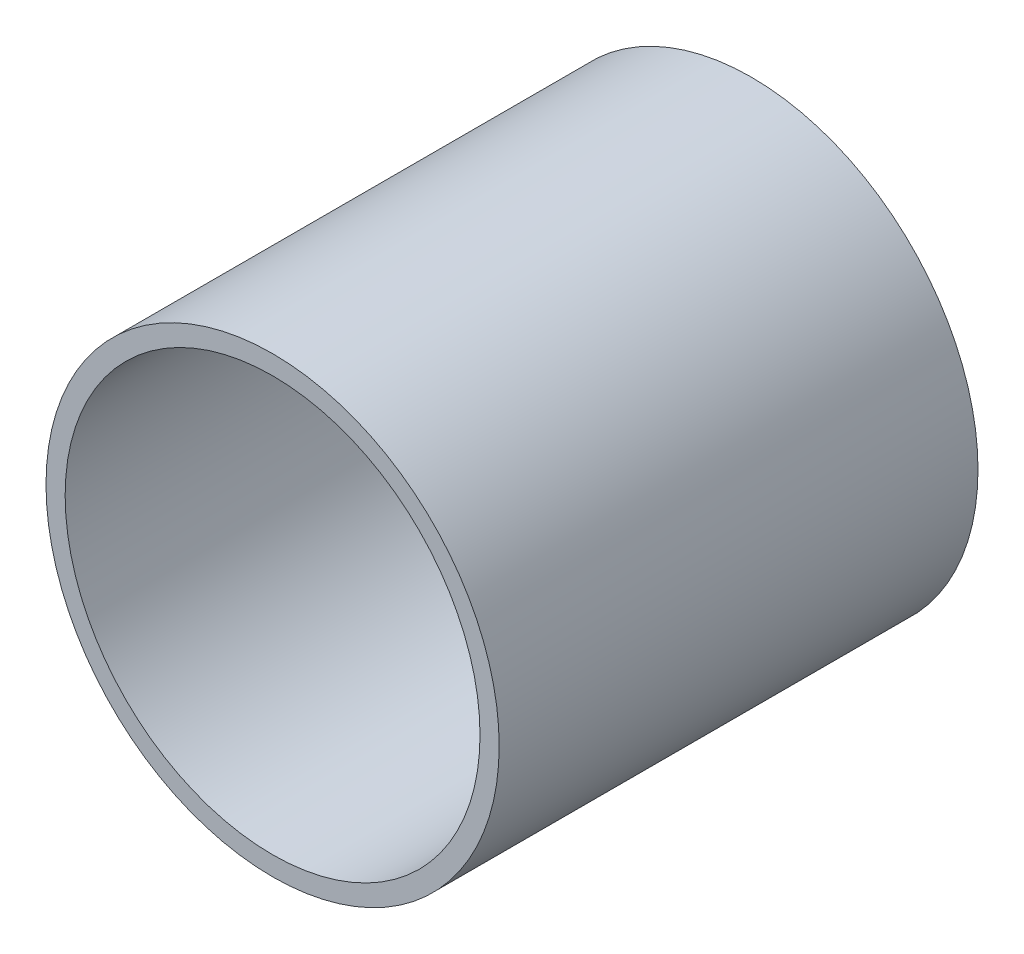
ISO-10303-21;
HEADER;
FILE_DESCRIPTION(('STEP AP214'),'2;1');
FILE_NAME('part.step','',(''),(''),'','','');
FILE_SCHEMA(('AUTOMOTIVE_DESIGN { 1 0 10303 214 1 1 1 1 }'));
ENDSEC;
DATA;
#1=APPLICATION_CONTEXT('core data for automotive mechanical design processes');
#2=APPLICATION_PROTOCOL_DEFINITION('international standard','automotive_design',2000,#1);
#3=PRODUCT_CONTEXT('',#1,'mechanical');
#4=PRODUCT('Part','Part','',(#3));
#5=PRODUCT_RELATED_PRODUCT_CATEGORY('part','',(#4));
#6=PRODUCT_DEFINITION_FORMATION('','',#4);
#7=PRODUCT_DEFINITION_CONTEXT('part definition',#1,'design');
#8=PRODUCT_DEFINITION('design','',#6,#7);
#9=PRODUCT_DEFINITION_SHAPE('','',#8);
#10=(LENGTH_UNIT() NAMED_UNIT(*) SI_UNIT(.MILLI.,.METRE.));
#11=(NAMED_UNIT(*) PLANE_ANGLE_UNIT() SI_UNIT($,.RADIAN.));
#12=(NAMED_UNIT(*) SI_UNIT($,.STERADIAN.) SOLID_ANGLE_UNIT());
#13=UNCERTAINTY_MEASURE_WITH_UNIT(LENGTH_MEASURE(1.E-05),#10,'distance_accuracy_value','');
#14=(GEOMETRIC_REPRESENTATION_CONTEXT(3) GLOBAL_UNCERTAINTY_ASSIGNED_CONTEXT((#13)) GLOBAL_UNIT_ASSIGNED_CONTEXT((#10,
#11,#12)) REPRESENTATION_CONTEXT('',''));
#15=CARTESIAN_POINT('',(0.,0.,0.));
#16=DIRECTION('',(0.,0.,1.));
#17=DIRECTION('',(1.,0.,0.));
#18=AXIS2_PLACEMENT_3D('',#15,#16,#17);
#19=CARTESIAN_POINT('',(0.,0.,88.9));
#20=DIRECTION('',(0.,0.,1.));
#21=DIRECTION('',(1.,0.,0.));
#22=AXIS2_PLACEMENT_3D('',#19,#20,#21);
#23=PLANE('',#22);
#24=CARTESIAN_POINT('',(0.,0.,88.9));
#25=DIRECTION('',(0.,0.,1.));
#26=DIRECTION('',(1.,0.,0.));
#27=AXIS2_PLACEMENT_3D('',#24,#25,#26);
#28=CIRCLE('',#27,84.1375);
#29=CARTESIAN_POINT('',(84.1375,0.,88.9));
#30=VERTEX_POINT('',#29);
#31=EDGE_CURVE('E10',#30,#30,#28,.T.);
#32=ORIENTED_EDGE('',*,*,#31,.T.);
#33=EDGE_LOOP('',(#32));
#34=FACE_BOUND('',#33,.T.);
#35=CARTESIAN_POINT('',(0.,0.,88.9));
#36=DIRECTION('',(0.,0.,1.));
#37=DIRECTION('',(1.,0.,0.));
#38=AXIS2_PLACEMENT_3D('',#35,#36,#37);
#39=CIRCLE('',#38,77.0255);
#40=CARTESIAN_POINT('',(77.0255,0.,88.9));
#41=VERTEX_POINT('',#40);
#42=EDGE_CURVE('E42',#41,#41,#39,.T.);
#43=ORIENTED_EDGE('',*,*,#42,.F.);
#44=EDGE_LOOP('',(#43));
#45=FACE_BOUND('',#44,.T.);
#46=ADVANCED_FACE('F31',(#34,#45),#23,.T.);
#47=CARTESIAN_POINT('',(0.,0.,-88.9));
#48=DIRECTION('',(0.,0.,1.));
#49=DIRECTION('',(1.,0.,0.));
#50=AXIS2_PLACEMENT_3D('',#47,#48,#49);
#51=PLANE('',#50);
#52=CARTESIAN_POINT('',(0.,0.,-88.9));
#53=DIRECTION('',(0.,0.,1.));
#54=DIRECTION('',(1.,0.,0.));
#55=AXIS2_PLACEMENT_3D('',#52,#53,#54);
#56=CIRCLE('',#55,84.1375);
#57=CARTESIAN_POINT('',(84.1375,0.,-88.9));
#58=VERTEX_POINT('',#57);
#59=EDGE_CURVE('E35',#58,#58,#56,.T.);
#60=ORIENTED_EDGE('',*,*,#59,.F.);
#61=EDGE_LOOP('',(#60));
#62=FACE_BOUND('',#61,.T.);
#63=CARTESIAN_POINT('',(0.,0.,-88.9));
#64=DIRECTION('',(0.,0.,1.));
#65=DIRECTION('',(1.,0.,0.));
#66=AXIS2_PLACEMENT_3D('',#63,#64,#65);
#67=CIRCLE('',#66,77.0255);
#68=CARTESIAN_POINT('',(77.0255,0.,-88.9));
#69=VERTEX_POINT('',#68);
#70=EDGE_CURVE('E44',#69,#69,#67,.T.);
#71=ORIENTED_EDGE('',*,*,#70,.T.);
#72=EDGE_LOOP('',(#71));
#73=FACE_BOUND('',#72,.T.);
#74=ADVANCED_FACE('F54',(#62,#73),#51,.F.);
#75=CARTESIAN_POINT('',(0.,0.,88.9));
#76=DIRECTION('',(0.,0.,-1.));
#77=DIRECTION('',(-1.,0.,0.));
#78=AXIS2_PLACEMENT_3D('',#75,#76,#77);
#79=CYLINDRICAL_SURFACE('',#78,84.1375);
#80=ORIENTED_EDGE('',*,*,#31,.F.);
#81=EDGE_LOOP('',(#80));
#82=FACE_BOUND('',#81,.T.);
#83=ORIENTED_EDGE('',*,*,#59,.T.);
#84=EDGE_LOOP('',(#83));
#85=FACE_BOUND('',#84,.T.);
#86=ADVANCED_FACE('F33',(#82,#85),#79,.T.);
#87=CARTESIAN_POINT('',(0.,0.,88.9));
#88=DIRECTION('',(0.,0.,-1.));
#89=DIRECTION('',(-1.,0.,0.));
#90=AXIS2_PLACEMENT_3D('',#87,#88,#89);
#91=CYLINDRICAL_SURFACE('',#90,77.0255);
#92=ORIENTED_EDGE('',*,*,#42,.T.);
#93=EDGE_LOOP('',(#92));
#94=FACE_BOUND('',#93,.T.);
#95=ORIENTED_EDGE('',*,*,#70,.F.);
#96=EDGE_LOOP('',(#95));
#97=FACE_BOUND('',#96,.T.);
#98=ADVANCED_FACE('F50',(#94,#97),#91,.F.);
#99=CLOSED_SHELL('',(#46,#74,#86,#98));
#100=MANIFOLD_SOLID_BREP('B2',#99);
#101=ADVANCED_BREP_SHAPE_REPRESENTATION('',(#18,#100),#14);
#102=SHAPE_DEFINITION_REPRESENTATION(#9,#101);
ENDSEC;
END-ISO-10303-21;
